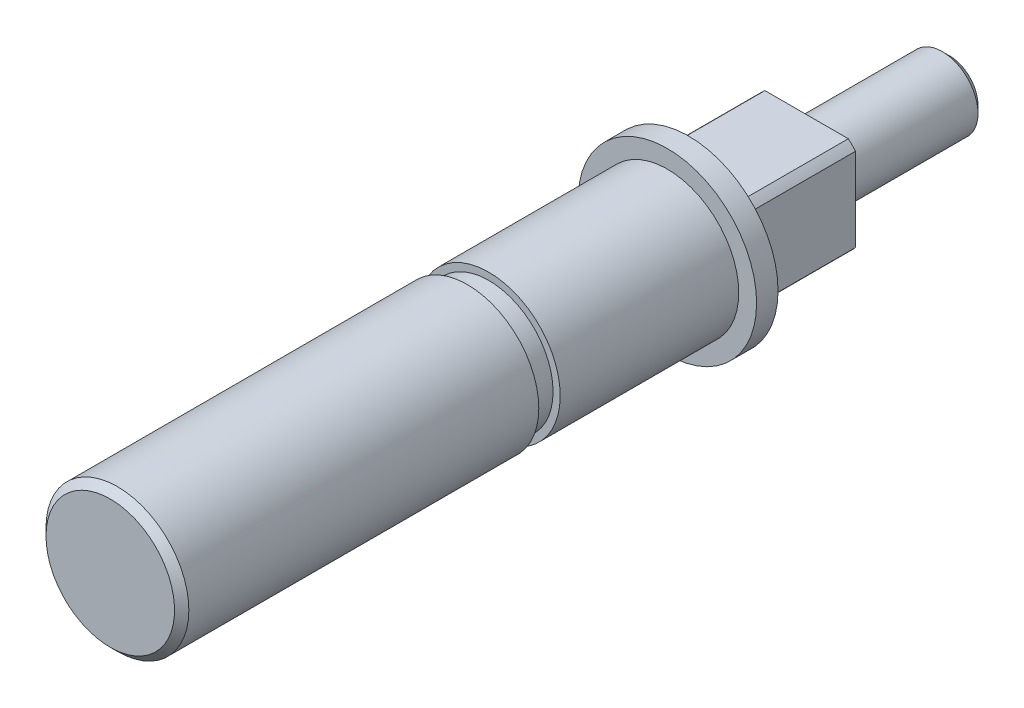
ISO-10303-21;
HEADER;
FILE_DESCRIPTION(('STEP AP214'),'2;1');
FILE_NAME('part.step','',(''),(''),'','','');
FILE_SCHEMA(('AUTOMOTIVE_DESIGN { 1 0 10303 214 1 1 1 1 }'));
ENDSEC;
DATA;
#1=APPLICATION_CONTEXT('core data for automotive mechanical design processes');
#2=APPLICATION_PROTOCOL_DEFINITION('international standard','automotive_design',2000,#1);
#3=PRODUCT_CONTEXT('',#1,'mechanical');
#4=PRODUCT('Part','Part','',(#3));
#5=PRODUCT_RELATED_PRODUCT_CATEGORY('part','',(#4));
#6=PRODUCT_DEFINITION_FORMATION('','',#4);
#7=PRODUCT_DEFINITION_CONTEXT('part definition',#1,'design');
#8=PRODUCT_DEFINITION('design','',#6,#7);
#9=PRODUCT_DEFINITION_SHAPE('','',#8);
#10=(LENGTH_UNIT() NAMED_UNIT(*) SI_UNIT(.MILLI.,.METRE.));
#11=(NAMED_UNIT(*) PLANE_ANGLE_UNIT() SI_UNIT($,.RADIAN.));
#12=(NAMED_UNIT(*) SI_UNIT($,.STERADIAN.) SOLID_ANGLE_UNIT());
#13=UNCERTAINTY_MEASURE_WITH_UNIT(LENGTH_MEASURE(1.E-05),#10,'distance_accuracy_value','');
#14=(GEOMETRIC_REPRESENTATION_CONTEXT(3) GLOBAL_UNCERTAINTY_ASSIGNED_CONTEXT((#13)) GLOBAL_UNIT_ASSIGNED_CONTEXT((#10,
#11,#12)) REPRESENTATION_CONTEXT('',''));
#15=CARTESIAN_POINT('',(0.,0.,0.));
#16=DIRECTION('',(0.,0.,1.));
#17=DIRECTION('',(1.,0.,0.));
#18=AXIS2_PLACEMENT_3D('',#15,#16,#17);
#19=CARTESIAN_POINT('',(0.,5.,20.));
#20=DIRECTION('',(0.,0.,1.));
#21=DIRECTION('',(1.,0.,0.));
#22=AXIS2_PLACEMENT_3D('',#19,#20,#21);
#23=PLANE('',#22);
#24=CARTESIAN_POINT('',(0.,0.,20.));
#25=DIRECTION('',(0.,0.,1.));
#26=DIRECTION('',(1.,0.,0.));
#27=AXIS2_PLACEMENT_3D('',#24,#25,#26);
#28=CIRCLE('',#27,5.);
#29=CARTESIAN_POINT('',(5.,0.,20.));
#30=VERTEX_POINT('',#29);
#31=EDGE_CURVE('E197',#30,#30,#28,.T.);
#32=ORIENTED_EDGE('',*,*,#31,.T.);
#33=EDGE_LOOP('',(#32));
#34=FACE_BOUND('',#33,.T.);
#35=DIRECTION('',(0.,-1.,0.));
#36=VECTOR('',#35,1.);
#37=CARTESIAN_POINT('',(6.85,6.85,20.));
#38=LINE('',#37,#36);
#39=CARTESIAN_POINT('',(6.85,5.83759368233179,20.));
#40=VERTEX_POINT('',#39);
#41=CARTESIAN_POINT('',(6.85,-5.83759368233179,20.));
#42=VERTEX_POINT('',#41);
#43=EDGE_CURVE('E172',#40,#42,#38,.T.);
#44=ORIENTED_EDGE('',*,*,#43,.T.);
#45=CARTESIAN_POINT('',(0.,0.,20.));
#46=DIRECTION('',(0.,0.,1.));
#47=DIRECTION('',(1.,0.,0.));
#48=AXIS2_PLACEMENT_3D('',#45,#46,#47);
#49=CIRCLE('',#48,9.);
#50=CARTESIAN_POINT('',(5.83759368233179,-6.85,20.));
#51=VERTEX_POINT('',#50);
#52=EDGE_CURVE('E124',#51,#42,#49,.T.);
#53=ORIENTED_EDGE('',*,*,#52,.F.);
#54=DIRECTION('',(-1.,0.,0.));
#55=VECTOR('',#54,1.);
#56=CARTESIAN_POINT('',(6.85,-6.85,20.));
#57=LINE('',#56,#55);
#58=CARTESIAN_POINT('',(-5.83759368233179,-6.85,20.));
#59=VERTEX_POINT('',#58);
#60=EDGE_CURVE('E109',#51,#59,#57,.T.);
#61=ORIENTED_EDGE('',*,*,#60,.T.);
#62=CARTESIAN_POINT('',(-6.85,-5.83759368233178,20.));
#63=VERTEX_POINT('',#62);
#64=EDGE_CURVE('E129',#63,#59,#49,.T.);
#65=ORIENTED_EDGE('',*,*,#64,.F.);
#66=DIRECTION('',(0.,1.,0.));
#67=VECTOR('',#66,1.);
#68=CARTESIAN_POINT('',(-6.85,6.85,20.));
#69=LINE('',#68,#67);
#70=CARTESIAN_POINT('',(-6.85,5.83759368233178,20.));
#71=VERTEX_POINT('',#70);
#72=EDGE_CURVE('E178',#63,#71,#69,.T.);
#73=ORIENTED_EDGE('',*,*,#72,.T.);
#74=CARTESIAN_POINT('',(-5.83759368233179,6.84999999999999,20.));
#75=VERTEX_POINT('',#74);
#76=EDGE_CURVE('E184',#75,#71,#49,.T.);
#77=ORIENTED_EDGE('',*,*,#76,.F.);
#78=DIRECTION('',(1.,0.,0.));
#79=VECTOR('',#78,1.);
#80=CARTESIAN_POINT('',(6.85,6.85,20.));
#81=LINE('',#80,#79);
#82=CARTESIAN_POINT('',(5.83759368233179,6.85,20.));
#83=VERTEX_POINT('',#82);
#84=EDGE_CURVE('E175',#75,#83,#81,.T.);
#85=ORIENTED_EDGE('',*,*,#84,.T.);
#86=EDGE_CURVE('E118',#40,#83,#49,.T.);
#87=ORIENTED_EDGE('',*,*,#86,.F.);
#88=EDGE_LOOP('',(#44,#53,#61,#65,#73,#77,#85,#87));
#89=FACE_BOUND('',#88,.T.);
#90=ADVANCED_FACE('F35',(#34,#89),#23,.F.);
#91=CARTESIAN_POINT('',(0.,0.,117.5));
#92=DIRECTION('',(0.,0.,1.));
#93=DIRECTION('',(1.,0.,0.));
#94=AXIS2_PLACEMENT_3D('',#91,#92,#93);
#95=CYLINDRICAL_SURFACE('',#94,9.);
#96=DIRECTION('',(0.,0.,1.));
#97=VECTOR('',#96,1.);
#98=CARTESIAN_POINT('',(6.85,5.83759368233179,117.5));
#99=LINE('',#98,#97);
#100=CARTESIAN_POINT('',(6.85,5.83759368233179,36.5));
#101=VERTEX_POINT('',#100);
#102=EDGE_CURVE('E157',#40,#101,#99,.T.);
#103=ORIENTED_EDGE('',*,*,#102,.F.);
#104=ORIENTED_EDGE('',*,*,#86,.T.);
#105=DIRECTION('',(0.,0.,1.));
#106=VECTOR('',#105,1.);
#107=CARTESIAN_POINT('',(5.83759368233179,6.85,117.5));
#108=LINE('',#107,#106);
#109=CARTESIAN_POINT('',(5.83759368233179,6.85,36.5));
#110=VERTEX_POINT('',#109);
#111=EDGE_CURVE('E102',#110,#83,#108,.F.);
#112=ORIENTED_EDGE('',*,*,#111,.F.);
#113=CARTESIAN_POINT('',(0.,0.,36.5));
#114=DIRECTION('',(0.,0.,1.));
#115=DIRECTION('',(1.,0.,0.));
#116=AXIS2_PLACEMENT_3D('',#113,#114,#115);
#117=CIRCLE('',#116,9.);
#118=EDGE_CURVE('E116',#101,#110,#117,.T.);
#119=ORIENTED_EDGE('',*,*,#118,.F.);
#120=EDGE_LOOP('',(#103,#104,#112,#119));
#121=FACE_BOUND('',#120,.T.);
#122=ADVANCED_FACE('F115',(#121),#95,.T.);
#123=DIRECTION('',(0.,0.,1.));
#124=VECTOR('',#123,1.);
#125=CARTESIAN_POINT('',(6.85,-5.83759368233178,117.5));
#126=LINE('',#125,#124);
#127=CARTESIAN_POINT('',(6.85,-5.83759368233178,36.5));
#128=VERTEX_POINT('',#127);
#129=EDGE_CURVE('E159',#128,#42,#126,.F.);
#130=ORIENTED_EDGE('',*,*,#129,.F.);
#131=CARTESIAN_POINT('',(5.83759368233179,-6.85,36.5));
#132=VERTEX_POINT('',#131);
#133=EDGE_CURVE('E127',#132,#128,#117,.T.);
#134=ORIENTED_EDGE('',*,*,#133,.F.);
#135=DIRECTION('',(0.,0.,1.));
#136=VECTOR('',#135,1.);
#137=CARTESIAN_POINT('',(5.83759368233178,-6.85,117.5));
#138=LINE('',#137,#136);
#139=EDGE_CURVE('E165',#51,#132,#138,.T.);
#140=ORIENTED_EDGE('',*,*,#139,.F.);
#141=ORIENTED_EDGE('',*,*,#52,.T.);
#142=EDGE_LOOP('',(#130,#134,#140,#141));
#143=FACE_BOUND('',#142,.T.);
#144=ADVANCED_FACE('F224',(#143),#95,.T.);
#145=DIRECTION('',(0.,0.,1.));
#146=VECTOR('',#145,1.);
#147=CARTESIAN_POINT('',(-5.83759368233179,6.85,117.5));
#148=LINE('',#147,#146);
#149=CARTESIAN_POINT('',(-5.83759368233179,6.85,36.5));
#150=VERTEX_POINT('',#149);
#151=EDGE_CURVE('E105',#75,#150,#148,.T.);
#152=ORIENTED_EDGE('',*,*,#151,.F.);
#153=ORIENTED_EDGE('',*,*,#76,.T.);
#154=DIRECTION('',(0.,0.,1.));
#155=VECTOR('',#154,1.);
#156=CARTESIAN_POINT('',(-6.85,5.83759368233178,117.5));
#157=LINE('',#156,#155);
#158=CARTESIAN_POINT('',(-6.85,5.83759368233178,36.5));
#159=VERTEX_POINT('',#158);
#160=EDGE_CURVE('E163',#159,#71,#157,.F.);
#161=ORIENTED_EDGE('',*,*,#160,.F.);
#162=EDGE_CURVE('E125',#150,#159,#117,.T.);
#163=ORIENTED_EDGE('',*,*,#162,.F.);
#164=EDGE_LOOP('',(#152,#153,#161,#163));
#165=FACE_BOUND('',#164,.T.);
#166=ADVANCED_FACE('F186',(#165),#95,.T.);
#167=DIRECTION('',(0.,0.,1.));
#168=VECTOR('',#167,1.);
#169=CARTESIAN_POINT('',(-6.85,-5.83759368233178,117.5));
#170=LINE('',#169,#168);
#171=CARTESIAN_POINT('',(-6.85,-5.83759368233179,36.5));
#172=VERTEX_POINT('',#171);
#173=EDGE_CURVE('E119',#63,#172,#170,.T.);
#174=ORIENTED_EDGE('',*,*,#173,.F.);
#175=ORIENTED_EDGE('',*,*,#64,.T.);
#176=DIRECTION('',(0.,0.,1.));
#177=VECTOR('',#176,1.);
#178=CARTESIAN_POINT('',(-5.83759368233178,-6.85,117.5));
#179=LINE('',#178,#177);
#180=CARTESIAN_POINT('',(-5.83759368233179,-6.85,36.5));
#181=VERTEX_POINT('',#180);
#182=EDGE_CURVE('E167',#181,#59,#179,.F.);
#183=ORIENTED_EDGE('',*,*,#182,.F.);
#184=EDGE_CURVE('E131',#172,#181,#117,.T.);
#185=ORIENTED_EDGE('',*,*,#184,.F.);
#186=EDGE_LOOP('',(#174,#175,#183,#185));
#187=FACE_BOUND('',#186,.T.);
#188=ADVANCED_FACE('F226',(#187),#95,.T.);
#189=CARTESIAN_POINT('',(0.,9.99999999999999,117.5));
#190=DIRECTION('',(0.,0.,-1.));
#191=DIRECTION('',(-1.,0.,0.));
#192=AXIS2_PLACEMENT_3D('',#189,#190,#191);
#193=PLANE('',#192);
#194=CARTESIAN_POINT('',(0.,0.,117.5));
#195=DIRECTION('',(0.,0.,-1.));
#196=DIRECTION('',(-1.,0.,0.));
#197=AXIS2_PLACEMENT_3D('',#194,#195,#196);
#198=CIRCLE('',#197,8.99999999999999);
#199=CARTESIAN_POINT('',(-8.99999999999999,0.,117.5));
#200=VERTEX_POINT('',#199);
#201=EDGE_CURVE('E43',#200,#200,#198,.F.);
#202=ORIENTED_EDGE('',*,*,#201,.T.);
#203=EDGE_LOOP('',(#202));
#204=FACE_BOUND('',#203,.T.);
#205=ADVANCED_FACE('F208',(#204),#193,.F.);
#206=CARTESIAN_POINT('',(0.,0.,0.));
#207=DIRECTION('',(0.,0.,1.));
#208=DIRECTION('',(1.,0.,0.));
#209=AXIS2_PLACEMENT_3D('',#206,#207,#208);
#210=PLANE('',#209);
#211=CARTESIAN_POINT('',(0.,0.,0.));
#212=DIRECTION('',(0.,0.,1.));
#213=DIRECTION('',(1.,0.,0.));
#214=AXIS2_PLACEMENT_3D('',#211,#212,#213);
#215=CIRCLE('',#214,3.99999999999999);
#216=CARTESIAN_POINT('',(3.99999999999999,0.,0.));
#217=VERTEX_POINT('',#216);
#218=EDGE_CURVE('E203',#217,#217,#215,.F.);
#219=ORIENTED_EDGE('',*,*,#218,.T.);
#220=EDGE_LOOP('',(#219));
#221=FACE_BOUND('',#220,.T.);
#222=ADVANCED_FACE('F232',(#221),#210,.F.);
#223=CARTESIAN_POINT('',(0.,0.,117.5));
#224=DIRECTION('',(0.,0.,1.));
#225=DIRECTION('',(1.,0.,0.));
#226=AXIS2_PLACEMENT_3D('',#223,#224,#225);
#227=CYLINDRICAL_SURFACE('',#226,5.);
#228=CARTESIAN_POINT('',(0.,0.,1.00000000000001));
#229=DIRECTION('',(0.,0.,1.));
#230=DIRECTION('',(1.,0.,0.));
#231=AXIS2_PLACEMENT_3D('',#228,#229,#230);
#232=CIRCLE('',#231,5.);
#233=CARTESIAN_POINT('',(5.,0.,1.00000000000001));
#234=VERTEX_POINT('',#233);
#235=EDGE_CURVE('E200',#234,#234,#232,.T.);
#236=ORIENTED_EDGE('',*,*,#235,.T.);
#237=EDGE_LOOP('',(#236));
#238=FACE_BOUND('',#237,.T.);
#239=ORIENTED_EDGE('',*,*,#31,.F.);
#240=EDGE_LOOP('',(#239));
#241=FACE_BOUND('',#240,.T.);
#242=ADVANCED_FACE('F229',(#238,#241),#227,.T.);
#243=CARTESIAN_POINT('',(0.,9.,36.5));
#244=DIRECTION('',(0.,0.,1.));
#245=DIRECTION('',(1.,0.,0.));
#246=AXIS2_PLACEMENT_3D('',#243,#244,#245);
#247=PLANE('',#246);
#248=ORIENTED_EDGE('',*,*,#133,.T.);
#249=DIRECTION('',(0.,-1.,0.));
#250=VECTOR('',#249,1.);
#251=CARTESIAN_POINT('',(6.85,6.85,36.5));
#252=LINE('',#251,#250);
#253=EDGE_CURVE('E108',#101,#128,#252,.T.);
#254=ORIENTED_EDGE('',*,*,#253,.F.);
#255=ORIENTED_EDGE('',*,*,#118,.T.);
#256=DIRECTION('',(1.,0.,0.));
#257=VECTOR('',#256,1.);
#258=CARTESIAN_POINT('',(6.85,6.85,36.5));
#259=LINE('',#258,#257);
#260=EDGE_CURVE('E99',#150,#110,#259,.T.);
#261=ORIENTED_EDGE('',*,*,#260,.F.);
#262=ORIENTED_EDGE('',*,*,#162,.T.);
#263=DIRECTION('',(0.,1.,0.));
#264=VECTOR('',#263,1.);
#265=CARTESIAN_POINT('',(-6.85,6.85,36.5));
#266=LINE('',#265,#264);
#267=EDGE_CURVE('E56',#172,#159,#266,.T.);
#268=ORIENTED_EDGE('',*,*,#267,.F.);
#269=ORIENTED_EDGE('',*,*,#184,.T.);
#270=DIRECTION('',(-1.,0.,0.));
#271=VECTOR('',#270,1.);
#272=CARTESIAN_POINT('',(6.85,-6.85,36.5));
#273=LINE('',#272,#271);
#274=EDGE_CURVE('E50',#132,#181,#273,.T.);
#275=ORIENTED_EDGE('',*,*,#274,.F.);
#276=EDGE_LOOP('',(#248,#254,#255,#261,#262,#268,#269,#275));
#277=FACE_BOUND('',#276,.T.);
#278=CARTESIAN_POINT('',(0.,0.,36.5));
#279=DIRECTION('',(0.,0.,1.));
#280=DIRECTION('',(1.,0.,0.));
#281=AXIS2_PLACEMENT_3D('',#278,#279,#280);
#282=CIRCLE('',#281,12.5);
#283=CARTESIAN_POINT('',(12.5,0.,36.5));
#284=VERTEX_POINT('',#283);
#285=EDGE_CURVE('E133',#284,#284,#282,.T.);
#286=ORIENTED_EDGE('',*,*,#285,.F.);
#287=EDGE_LOOP('',(#286));
#288=FACE_BOUND('',#287,.T.);
#289=ADVANCED_FACE('F121',(#277,#288),#247,.F.);
#290=CARTESIAN_POINT('',(0.,0.,117.5));
#291=DIRECTION('',(0.,0.,1.));
#292=DIRECTION('',(1.,0.,0.));
#293=AXIS2_PLACEMENT_3D('',#290,#291,#292);
#294=CYLINDRICAL_SURFACE('',#293,12.5);
#295=CARTESIAN_POINT('',(0.,0.,39.5));
#296=DIRECTION('',(0.,0.,1.));
#297=DIRECTION('',(1.,0.,0.));
#298=AXIS2_PLACEMENT_3D('',#295,#296,#297);
#299=CIRCLE('',#298,12.5);
#300=CARTESIAN_POINT('',(12.5,0.,39.5));
#301=VERTEX_POINT('',#300);
#302=EDGE_CURVE('E136',#301,#301,#299,.T.);
#303=ORIENTED_EDGE('',*,*,#302,.F.);
#304=EDGE_LOOP('',(#303));
#305=FACE_BOUND('',#304,.T.);
#306=ORIENTED_EDGE('',*,*,#285,.T.);
#307=EDGE_LOOP('',(#306));
#308=FACE_BOUND('',#307,.T.);
#309=ADVANCED_FACE('F284',(#305,#308),#294,.T.);
#310=CARTESIAN_POINT('',(0.,12.5,39.5));
#311=DIRECTION('',(0.,0.,-1.));
#312=DIRECTION('',(-1.,0.,0.));
#313=AXIS2_PLACEMENT_3D('',#310,#311,#312);
#314=PLANE('',#313);
#315=CARTESIAN_POINT('',(0.,0.,39.5));
#316=DIRECTION('',(0.,0.,1.));
#317=DIRECTION('',(1.,0.,0.));
#318=AXIS2_PLACEMENT_3D('',#315,#316,#317);
#319=CIRCLE('',#318,10.);
#320=CARTESIAN_POINT('',(10.,0.,39.5));
#321=VERTEX_POINT('',#320);
#322=EDGE_CURVE('E140',#321,#321,#319,.T.);
#323=ORIENTED_EDGE('',*,*,#322,.F.);
#324=EDGE_LOOP('',(#323));
#325=FACE_BOUND('',#324,.T.);
#326=ORIENTED_EDGE('',*,*,#302,.T.);
#327=EDGE_LOOP('',(#326));
#328=FACE_BOUND('',#327,.T.);
#329=ADVANCED_FACE('F280',(#325,#328),#314,.F.);
#330=CARTESIAN_POINT('',(0.,0.,117.5));
#331=DIRECTION('',(0.,0.,1.));
#332=DIRECTION('',(1.,0.,0.));
#333=AXIS2_PLACEMENT_3D('',#330,#331,#332);
#334=CYLINDRICAL_SURFACE('',#333,10.);
#335=CARTESIAN_POINT('',(0.,0.,64.5));
#336=DIRECTION('',(0.,0.,1.));
#337=DIRECTION('',(1.,0.,0.));
#338=AXIS2_PLACEMENT_3D('',#335,#336,#337);
#339=CIRCLE('',#338,10.);
#340=CARTESIAN_POINT('',(10.,0.,64.5));
#341=VERTEX_POINT('',#340);
#342=EDGE_CURVE('E145',#341,#341,#339,.T.);
#343=ORIENTED_EDGE('',*,*,#342,.F.);
#344=EDGE_LOOP('',(#343));
#345=FACE_BOUND('',#344,.T.);
#346=ORIENTED_EDGE('',*,*,#322,.T.);
#347=EDGE_LOOP('',(#346));
#348=FACE_BOUND('',#347,.T.);
#349=ADVANCED_FACE('F276',(#345,#348),#334,.T.);
#350=CARTESIAN_POINT('',(0.,10.,64.5));
#351=DIRECTION('',(0.,0.,-1.));
#352=DIRECTION('',(-1.,0.,0.));
#353=AXIS2_PLACEMENT_3D('',#350,#351,#352);
#354=PLANE('',#353);
#355=CARTESIAN_POINT('',(0.,0.,64.5));
#356=DIRECTION('',(0.,0.,1.));
#357=DIRECTION('',(1.,0.,0.));
#358=AXIS2_PLACEMENT_3D('',#355,#356,#357);
#359=CIRCLE('',#358,9.);
#360=CARTESIAN_POINT('',(9.,0.,64.5));
#361=VERTEX_POINT('',#360);
#362=EDGE_CURVE('E148',#361,#361,#359,.T.);
#363=ORIENTED_EDGE('',*,*,#362,.F.);
#364=EDGE_LOOP('',(#363));
#365=FACE_BOUND('',#364,.T.);
#366=ORIENTED_EDGE('',*,*,#342,.T.);
#367=EDGE_LOOP('',(#366));
#368=FACE_BOUND('',#367,.T.);
#369=ADVANCED_FACE('F272',(#365,#368),#354,.F.);
#370=CARTESIAN_POINT('',(0.,0.,117.5));
#371=DIRECTION('',(0.,0.,1.));
#372=DIRECTION('',(1.,0.,0.));
#373=AXIS2_PLACEMENT_3D('',#370,#371,#372);
#374=CYLINDRICAL_SURFACE('',#373,9.);
#375=CARTESIAN_POINT('',(0.,0.,67.5));
#376=DIRECTION('',(0.,0.,1.));
#377=DIRECTION('',(1.,0.,0.));
#378=AXIS2_PLACEMENT_3D('',#375,#376,#377);
#379=CIRCLE('',#378,9.);
#380=CARTESIAN_POINT('',(9.,0.,67.5));
#381=VERTEX_POINT('',#380);
#382=EDGE_CURVE('E151',#381,#381,#379,.T.);
#383=ORIENTED_EDGE('',*,*,#382,.F.);
#384=EDGE_LOOP('',(#383));
#385=FACE_BOUND('',#384,.T.);
#386=ORIENTED_EDGE('',*,*,#362,.T.);
#387=EDGE_LOOP('',(#386));
#388=FACE_BOUND('',#387,.T.);
#389=ADVANCED_FACE('F268',(#385,#388),#374,.T.);
#390=CARTESIAN_POINT('',(0.,9.,67.5));
#391=DIRECTION('',(0.,0.,1.));
#392=DIRECTION('',(1.,0.,0.));
#393=AXIS2_PLACEMENT_3D('',#390,#391,#392);
#394=PLANE('',#393);
#395=CARTESIAN_POINT('',(0.,0.,67.5));
#396=DIRECTION('',(0.,0.,1.));
#397=DIRECTION('',(1.,0.,0.));
#398=AXIS2_PLACEMENT_3D('',#395,#396,#397);
#399=CIRCLE('',#398,10.);
#400=CARTESIAN_POINT('',(10.,0.,67.5));
#401=VERTEX_POINT('',#400);
#402=EDGE_CURVE('E154',#401,#401,#399,.T.);
#403=ORIENTED_EDGE('',*,*,#402,.F.);
#404=EDGE_LOOP('',(#403));
#405=FACE_BOUND('',#404,.T.);
#406=ORIENTED_EDGE('',*,*,#382,.T.);
#407=EDGE_LOOP('',(#406));
#408=FACE_BOUND('',#407,.T.);
#409=ADVANCED_FACE('F260',(#405,#408),#394,.F.);
#410=CARTESIAN_POINT('',(0.,0.,117.5));
#411=DIRECTION('',(0.,0.,1.));
#412=DIRECTION('',(1.,0.,0.));
#413=AXIS2_PLACEMENT_3D('',#410,#411,#412);
#414=CYLINDRICAL_SURFACE('',#413,10.);
#415=CARTESIAN_POINT('',(0.,0.,116.5));
#416=DIRECTION('',(0.,0.,-1.));
#417=DIRECTION('',(-1.,0.,0.));
#418=AXIS2_PLACEMENT_3D('',#415,#416,#417);
#419=CIRCLE('',#418,10.);
#420=CARTESIAN_POINT('',(-10.,0.,116.5));
#421=VERTEX_POINT('',#420);
#422=EDGE_CURVE('E12',#421,#421,#419,.T.);
#423=ORIENTED_EDGE('',*,*,#422,.T.);
#424=EDGE_LOOP('',(#423));
#425=FACE_BOUND('',#424,.T.);
#426=ORIENTED_EDGE('',*,*,#402,.T.);
#427=EDGE_LOOP('',(#426));
#428=FACE_BOUND('',#427,.T.);
#429=ADVANCED_FACE('F253',(#425,#428),#414,.T.);
#430=CARTESIAN_POINT('',(6.85,6.85,80.548939542943));
#431=DIRECTION('',(1.,0.,0.));
#432=DIRECTION('',(0.,1.,0.));
#433=AXIS2_PLACEMENT_3D('',#430,#431,#432);
#434=PLANE('',#433);
#435=ORIENTED_EDGE('',*,*,#102,.T.);
#436=ORIENTED_EDGE('',*,*,#253,.T.);
#437=ORIENTED_EDGE('',*,*,#129,.T.);
#438=ORIENTED_EDGE('',*,*,#43,.F.);
#439=EDGE_LOOP('',(#435,#436,#437,#438));
#440=FACE_BOUND('',#439,.T.);
#441=ADVANCED_FACE('F251',(#440),#434,.T.);
#442=CARTESIAN_POINT('',(6.85,-6.85,80.548939542943));
#443=DIRECTION('',(0.,-1.,0.));
#444=DIRECTION('',(0.,0.,-1.));
#445=AXIS2_PLACEMENT_3D('',#442,#443,#444);
#446=PLANE('',#445);
#447=ORIENTED_EDGE('',*,*,#139,.T.);
#448=ORIENTED_EDGE('',*,*,#274,.T.);
#449=ORIENTED_EDGE('',*,*,#182,.T.);
#450=ORIENTED_EDGE('',*,*,#60,.F.);
#451=EDGE_LOOP('',(#447,#448,#449,#450));
#452=FACE_BOUND('',#451,.T.);
#453=ADVANCED_FACE('F246',(#452),#446,.T.);
#454=CARTESIAN_POINT('',(-6.85,6.85,80.548939542943));
#455=DIRECTION('',(-1.,0.,0.));
#456=DIRECTION('',(0.,-1.,0.));
#457=AXIS2_PLACEMENT_3D('',#454,#455,#456);
#458=PLANE('',#457);
#459=ORIENTED_EDGE('',*,*,#173,.T.);
#460=ORIENTED_EDGE('',*,*,#267,.T.);
#461=ORIENTED_EDGE('',*,*,#160,.T.);
#462=ORIENTED_EDGE('',*,*,#72,.F.);
#463=EDGE_LOOP('',(#459,#460,#461,#462));
#464=FACE_BOUND('',#463,.T.);
#465=ADVANCED_FACE('F189',(#464),#458,.T.);
#466=CARTESIAN_POINT('',(6.85,6.85,80.548939542943));
#467=DIRECTION('',(0.,1.,0.));
#468=DIRECTION('',(-1.,0.,0.));
#469=AXIS2_PLACEMENT_3D('',#466,#467,#468);
#470=PLANE('',#469);
#471=ORIENTED_EDGE('',*,*,#151,.T.);
#472=ORIENTED_EDGE('',*,*,#260,.T.);
#473=ORIENTED_EDGE('',*,*,#111,.T.);
#474=ORIENTED_EDGE('',*,*,#84,.F.);
#475=EDGE_LOOP('',(#471,#472,#473,#474));
#476=FACE_BOUND('',#475,.T.);
#477=ADVANCED_FACE('F101',(#476),#470,.T.);
#478=CARTESIAN_POINT('',(0.,0.,1.00000000000001));
#479=DIRECTION('',(0.,0.,1.));
#480=DIRECTION('',(1.,0.,0.));
#481=AXIS2_PLACEMENT_3D('',#478,#479,#480);
#482=CONICAL_SURFACE('',#481,5.,0.785398163397446);
#483=ORIENTED_EDGE('',*,*,#218,.F.);
#484=EDGE_LOOP('',(#483));
#485=FACE_BOUND('',#484,.T.);
#486=ORIENTED_EDGE('',*,*,#235,.F.);
#487=EDGE_LOOP('',(#486));
#488=FACE_BOUND('',#487,.T.);
#489=ADVANCED_FACE('F211',(#485,#488),#482,.T.);
#490=CARTESIAN_POINT('',(0.,0.,117.5));
#491=DIRECTION('',(0.,0.,-1.));
#492=DIRECTION('',(-1.,0.,0.));
#493=AXIS2_PLACEMENT_3D('',#490,#491,#492);
#494=CONICAL_SURFACE('',#493,8.99999999999999,0.785398163397435);
#495=ORIENTED_EDGE('',*,*,#422,.F.);
#496=EDGE_LOOP('',(#495));
#497=FACE_BOUND('',#496,.T.);
#498=ORIENTED_EDGE('',*,*,#201,.F.);
#499=EDGE_LOOP('',(#498));
#500=FACE_BOUND('',#499,.T.);
#501=ADVANCED_FACE('F37',(#497,#500),#494,.T.);
#502=CLOSED_SHELL('',(#90,#122,#144,#166,#188,#205,#222,#242,#289,#309,#329,#349,#369,#389,#409,
#429,#441,#453,#465,#477,#489,#501));
#503=MANIFOLD_SOLID_BREP('B2',#502);
#504=ADVANCED_BREP_SHAPE_REPRESENTATION('',(#18,#503),#14);
#505=SHAPE_DEFINITION_REPRESENTATION(#9,#504);
ENDSEC;
END-ISO-10303-21;
